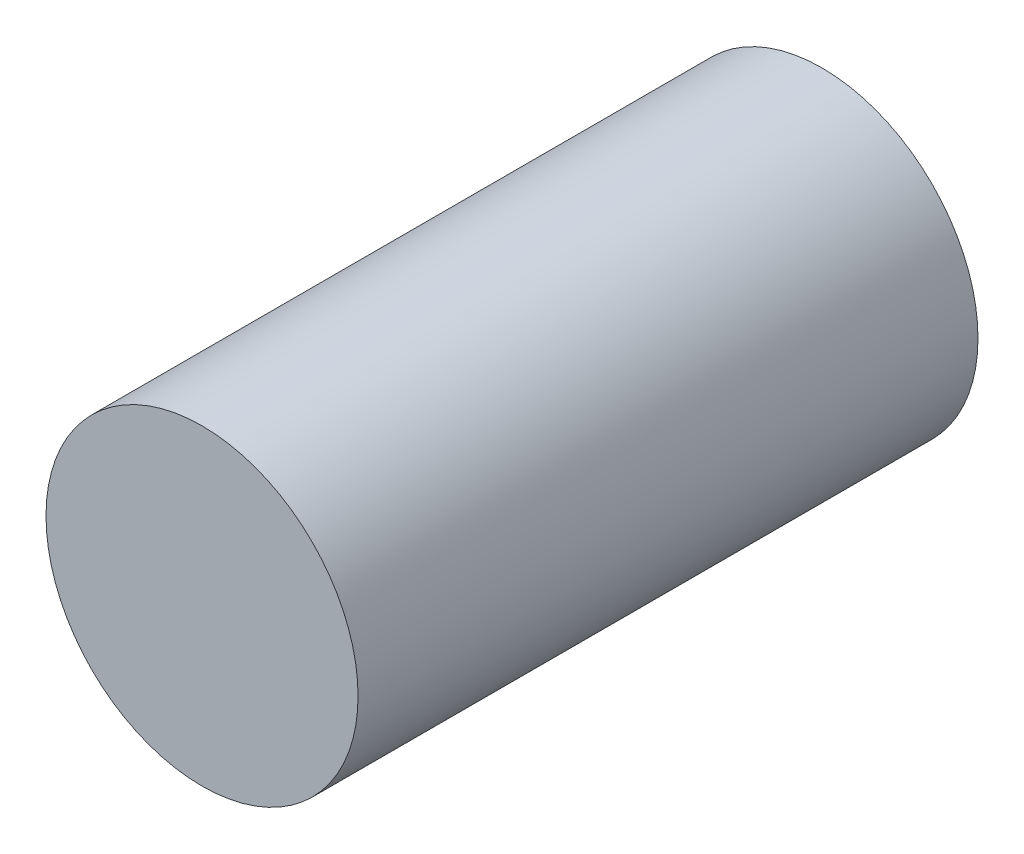
ISO-10303-21;
HEADER;
FILE_DESCRIPTION(('STEP AP214'),'2;1');
FILE_NAME('part.step','',(''),(''),'','','');
FILE_SCHEMA(('AUTOMOTIVE_DESIGN { 1 0 10303 214 1 1 1 1 }'));
ENDSEC;
DATA;
#1=APPLICATION_CONTEXT('core data for automotive mechanical design processes');
#2=APPLICATION_PROTOCOL_DEFINITION('international standard','automotive_design',2000,#1);
#3=PRODUCT_CONTEXT('',#1,'mechanical');
#4=PRODUCT('Part','Part','',(#3));
#5=PRODUCT_RELATED_PRODUCT_CATEGORY('part','',(#4));
#6=PRODUCT_DEFINITION_FORMATION('','',#4);
#7=PRODUCT_DEFINITION_CONTEXT('part definition',#1,'design');
#8=PRODUCT_DEFINITION('design','',#6,#7);
#9=PRODUCT_DEFINITION_SHAPE('','',#8);
#10=(LENGTH_UNIT() NAMED_UNIT(*) SI_UNIT(.MILLI.,.METRE.));
#11=(NAMED_UNIT(*) PLANE_ANGLE_UNIT() SI_UNIT($,.RADIAN.));
#12=(NAMED_UNIT(*) SI_UNIT($,.STERADIAN.) SOLID_ANGLE_UNIT());
#13=UNCERTAINTY_MEASURE_WITH_UNIT(LENGTH_MEASURE(1.E-05),#10,'distance_accuracy_value','');
#14=(GEOMETRIC_REPRESENTATION_CONTEXT(3) GLOBAL_UNCERTAINTY_ASSIGNED_CONTEXT((#13)) GLOBAL_UNIT_ASSIGNED_CONTEXT((#10,
#11,#12)) REPRESENTATION_CONTEXT('',''));
#15=CARTESIAN_POINT('',(0.,0.,0.));
#16=DIRECTION('',(0.,0.,1.));
#17=DIRECTION('',(1.,0.,0.));
#18=AXIS2_PLACEMENT_3D('',#15,#16,#17);
#19=CARTESIAN_POINT('',(0.,0.,148.));
#20=DIRECTION('',(0.,0.,-1.));
#21=DIRECTION('',(-1.,0.,0.));
#22=AXIS2_PLACEMENT_3D('',#19,#20,#21);
#23=CYLINDRICAL_SURFACE('',#22,37.25);
#24=CARTESIAN_POINT('',(0.,0.,148.));
#25=DIRECTION('',(0.,0.,1.));
#26=DIRECTION('',(1.,0.,0.));
#27=AXIS2_PLACEMENT_3D('',#24,#25,#26);
#28=CIRCLE('',#27,37.25);
#29=CARTESIAN_POINT('',(37.25,0.,148.));
#30=VERTEX_POINT('',#29);
#31=EDGE_CURVE('E10',#30,#30,#28,.T.);
#32=ORIENTED_EDGE('',*,*,#31,.F.);
#33=EDGE_LOOP('',(#32));
#34=FACE_BOUND('',#33,.T.);
#35=CARTESIAN_POINT('',(0.,0.,0.));
#36=DIRECTION('',(0.,0.,1.));
#37=DIRECTION('',(1.,0.,0.));
#38=AXIS2_PLACEMENT_3D('',#35,#36,#37);
#39=CIRCLE('',#38,37.25);
#40=CARTESIAN_POINT('',(37.25,0.,0.));
#41=VERTEX_POINT('',#40);
#42=EDGE_CURVE('E43',#41,#41,#39,.T.);
#43=ORIENTED_EDGE('',*,*,#42,.T.);
#44=EDGE_LOOP('',(#43));
#45=FACE_BOUND('',#44,.T.);
#46=ADVANCED_FACE('F40',(#34,#45),#23,.T.);
#47=CARTESIAN_POINT('',(0.,0.,148.));
#48=DIRECTION('',(0.,0.,1.));
#49=DIRECTION('',(1.,0.,0.));
#50=AXIS2_PLACEMENT_3D('',#47,#48,#49);
#51=PLANE('',#50);
#52=ORIENTED_EDGE('',*,*,#31,.T.);
#53=EDGE_LOOP('',(#52));
#54=FACE_BOUND('',#53,.T.);
#55=ADVANCED_FACE('F57',(#54),#51,.T.);
#56=CARTESIAN_POINT('',(0.,0.,0.));
#57=DIRECTION('',(0.,0.,1.));
#58=DIRECTION('',(1.,0.,0.));
#59=AXIS2_PLACEMENT_3D('',#56,#57,#58);
#60=PLANE('',#59);
#61=ORIENTED_EDGE('',*,*,#42,.F.);
#62=EDGE_LOOP('',(#61));
#63=FACE_BOUND('',#62,.T.);
#64=ADVANCED_FACE('F55',(#63),#60,.F.);
#65=CLOSED_SHELL('',(#46,#55,#64));
#66=MANIFOLD_SOLID_BREP('B2',#65);
#67=ADVANCED_BREP_SHAPE_REPRESENTATION('',(#18,#66),#14);
#68=SHAPE_DEFINITION_REPRESENTATION(#9,#67);
ENDSEC;
END-ISO-10303-21;
